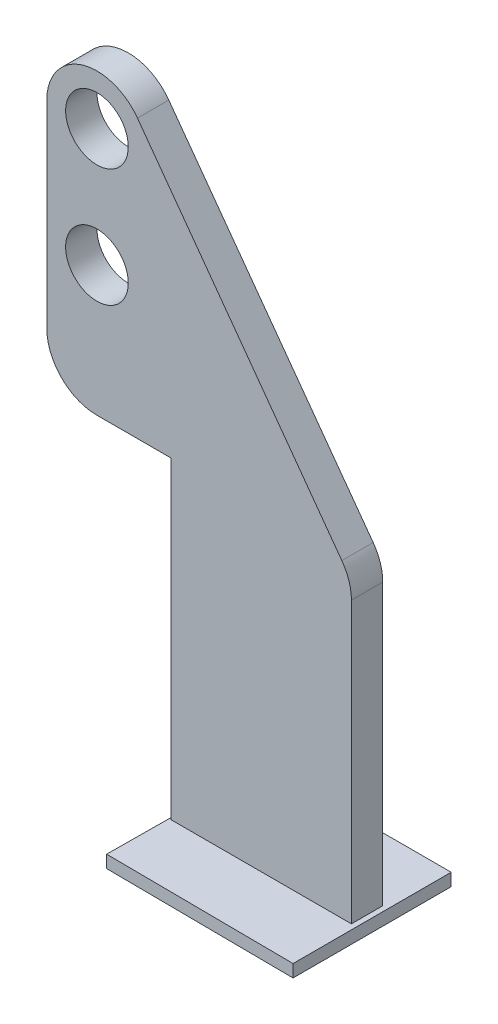
ISO-10303-21;
HEADER;
FILE_DESCRIPTION(('STEP AP214'),'2;1');
FILE_NAME('part.step','',(''),(''),'','','');
FILE_SCHEMA(('AUTOMOTIVE_DESIGN { 1 0 10303 214 1 1 1 1 }'));
ENDSEC;
DATA;
#1=APPLICATION_CONTEXT('core data for automotive mechanical design processes');
#2=APPLICATION_PROTOCOL_DEFINITION('international standard','automotive_design',2000,#1);
#3=PRODUCT_CONTEXT('',#1,'mechanical');
#4=PRODUCT('Part','Part','',(#3));
#5=PRODUCT_RELATED_PRODUCT_CATEGORY('part','',(#4));
#6=PRODUCT_DEFINITION_FORMATION('','',#4);
#7=PRODUCT_DEFINITION_CONTEXT('part definition',#1,'design');
#8=PRODUCT_DEFINITION('design','',#6,#7);
#9=PRODUCT_DEFINITION_SHAPE('','',#8);
#10=(LENGTH_UNIT() NAMED_UNIT(*) SI_UNIT(.MILLI.,.METRE.));
#11=(NAMED_UNIT(*) PLANE_ANGLE_UNIT() SI_UNIT($,.RADIAN.));
#12=(NAMED_UNIT(*) SI_UNIT($,.STERADIAN.) SOLID_ANGLE_UNIT());
#13=UNCERTAINTY_MEASURE_WITH_UNIT(LENGTH_MEASURE(1.E-05),#10,'distance_accuracy_value','');
#14=(GEOMETRIC_REPRESENTATION_CONTEXT(3) GLOBAL_UNCERTAINTY_ASSIGNED_CONTEXT((#13)) GLOBAL_UNIT_ASSIGNED_CONTEXT((#10,
#11,#12)) REPRESENTATION_CONTEXT('',''));
#15=CARTESIAN_POINT('',(0.,0.,0.));
#16=DIRECTION('',(0.,0.,1.));
#17=DIRECTION('',(1.,0.,0.));
#18=AXIS2_PLACEMENT_3D('',#15,#16,#17);
#19=CARTESIAN_POINT('',(5.28143268013956,-1.3339684011698,1.27));
#20=DIRECTION('',(0.,0.,1.));
#21=DIRECTION('',(1.,0.,0.));
#22=AXIS2_PLACEMENT_3D('',#19,#20,#21);
#23=PLANE('',#22);
#24=CARTESIAN_POINT('',(-3.00493153409958,10.0597565584507,1.27));
#25=DIRECTION('',(0.,0.,1.));
#26=DIRECTION('',(1.,0.,0.));
#27=AXIS2_PLACEMENT_3D('',#24,#25,#26);
#28=CIRCLE('',#27,1.27);
#29=CARTESIAN_POINT('',(-1.73493153409958,10.0597565584507,1.27));
#30=VERTEX_POINT('',#29);
#31=EDGE_CURVE('E151',#30,#30,#28,.T.);
#32=ORIENTED_EDGE('',*,*,#31,.F.);
#33=EDGE_LOOP('',(#32));
#34=FACE_BOUND('',#33,.T.);
#35=DIRECTION('',(0.,-1.,0.));
#36=VECTOR('',#35,1.);
#37=CARTESIAN_POINT('',(0.,0.,1.27));
#38=LINE('',#37,#36);
#39=CARTESIAN_POINT('',(0.,0.,1.27));
#40=VERTEX_POINT('',#39);
#41=CARTESIAN_POINT('',(0.,-12.7,1.27));
#42=VERTEX_POINT('',#41);
#43=EDGE_CURVE('E99',#40,#42,#38,.T.);
#44=ORIENTED_EDGE('',*,*,#43,.T.);
#45=DIRECTION('',(1.,0.,0.));
#46=VECTOR('',#45,1.);
#47=CARTESIAN_POINT('',(0.,-12.7,1.27));
#48=LINE('',#47,#46);
#49=CARTESIAN_POINT('',(7.31343268013956,-12.7,1.27));
#50=VERTEX_POINT('',#49);
#51=EDGE_CURVE('E208',#42,#50,#48,.T.);
#52=ORIENTED_EDGE('',*,*,#51,.T.);
#53=DIRECTION('',(0.,1.,0.));
#54=VECTOR('',#53,1.);
#55=CARTESIAN_POINT('',(7.31343268013956,-12.7,1.27));
#56=LINE('',#55,#54);
#57=CARTESIAN_POINT('',(7.31343268013956,-1.3339684011698,1.27));
#58=VERTEX_POINT('',#57);
#59=EDGE_CURVE('E197',#50,#58,#56,.T.);
#60=ORIENTED_EDGE('',*,*,#59,.T.);
#61=CARTESIAN_POINT('',(5.28143268013956,-1.3339684011698,1.27));
#62=DIRECTION('',(0.,0.,1.));
#63=DIRECTION('',(1.,0.,0.));
#64=AXIS2_PLACEMENT_3D('',#61,#62,#63);
#65=CIRCLE('',#64,2.032);
#66=CARTESIAN_POINT('',(6.92478311436092,-0.138801739007376,1.27));
#67=VERTEX_POINT('',#66);
#68=EDGE_CURVE('E223',#58,#67,#65,.T.);
#69=ORIENTED_EDGE('',*,*,#68,.T.);
#70=DIRECTION('',(-0.588172569961821,0.808735449912088,0.));
#71=VECTOR('',#70,1.);
#72=CARTESIAN_POINT('',(6.92478311436092,-0.138801739007376,1.27));
#73=LINE('',#72,#71);
#74=CARTESIAN_POINT('',(-1.36158109987822,11.2549232206131,1.27));
#75=VERTEX_POINT('',#74);
#76=EDGE_CURVE('E218',#67,#75,#73,.T.);
#77=ORIENTED_EDGE('',*,*,#76,.T.);
#78=CARTESIAN_POINT('',(-3.00493153409958,10.0597565584507,1.27));
#79=DIRECTION('',(0.,0.,1.));
#80=DIRECTION('',(1.,0.,0.));
#81=AXIS2_PLACEMENT_3D('',#78,#79,#80);
#82=CIRCLE('',#81,2.032);
#83=CARTESIAN_POINT('',(-5.03693153409958,10.0597565584507,1.27));
#84=VERTEX_POINT('',#83);
#85=EDGE_CURVE('E124',#75,#84,#82,.T.);
#86=ORIENTED_EDGE('',*,*,#85,.T.);
#87=DIRECTION('',(0.,-1.,0.));
#88=VECTOR('',#87,1.);
#89=CARTESIAN_POINT('',(-5.03693153409958,10.0597565584507,1.27));
#90=LINE('',#89,#88);
#91=CARTESIAN_POINT('',(-5.03693153409958,2.032,1.27));
#92=VERTEX_POINT('',#91);
#93=EDGE_CURVE('E118',#84,#92,#90,.T.);
#94=ORIENTED_EDGE('',*,*,#93,.T.);
#95=CARTESIAN_POINT('',(-3.00493153409958,2.032,1.27));
#96=DIRECTION('',(0.,0.,1.));
#97=DIRECTION('',(1.,0.,0.));
#98=AXIS2_PLACEMENT_3D('',#95,#96,#97);
#99=CIRCLE('',#98,2.032);
#100=CARTESIAN_POINT('',(-3.00493153409956,0.,1.27));
#101=VERTEX_POINT('',#100);
#102=EDGE_CURVE('E122',#92,#101,#99,.T.);
#103=ORIENTED_EDGE('',*,*,#102,.T.);
#104=DIRECTION('',(1.,0.,0.));
#105=VECTOR('',#104,1.);
#106=CARTESIAN_POINT('',(-3.00493153409956,0.,1.27));
#107=LINE('',#106,#105);
#108=EDGE_CURVE('E57',#101,#40,#107,.T.);
#109=ORIENTED_EDGE('',*,*,#108,.T.);
#110=EDGE_LOOP('',(#44,#52,#60,#69,#77,#86,#94,#103,#109));
#111=FACE_BOUND('',#110,.T.);
#112=CARTESIAN_POINT('',(-3.00493153409957,5.27395868039093,1.27));
#113=DIRECTION('',(0.,0.,1.));
#114=DIRECTION('',(1.,0.,0.));
#115=AXIS2_PLACEMENT_3D('',#112,#113,#114);
#116=CIRCLE('',#115,1.27);
#117=CARTESIAN_POINT('',(-1.73493153409957,5.27395868039093,1.27));
#118=VERTEX_POINT('',#117);
#119=EDGE_CURVE('E240',#118,#118,#116,.T.);
#120=ORIENTED_EDGE('',*,*,#119,.F.);
#121=EDGE_LOOP('',(#120));
#122=FACE_BOUND('',#121,.T.);
#123=ADVANCED_FACE('F39',(#34,#111,#122),#23,.T.);
#124=CARTESIAN_POINT('',(5.28143268013956,-1.3339684011698,0.));
#125=DIRECTION('',(0.,0.,1.));
#126=DIRECTION('',(1.,0.,0.));
#127=AXIS2_PLACEMENT_3D('',#124,#125,#126);
#128=PLANE('',#127);
#129=DIRECTION('',(0.,-1.,0.));
#130=VECTOR('',#129,1.);
#131=CARTESIAN_POINT('',(0.,0.,0.));
#132=LINE('',#131,#130);
#133=CARTESIAN_POINT('',(0.,0.,0.));
#134=VERTEX_POINT('',#133);
#135=CARTESIAN_POINT('',(0.,-12.7,0.));
#136=VERTEX_POINT('',#135);
#137=EDGE_CURVE('E146',#134,#136,#132,.T.);
#138=ORIENTED_EDGE('',*,*,#137,.F.);
#139=DIRECTION('',(1.,0.,0.));
#140=VECTOR('',#139,1.);
#141=CARTESIAN_POINT('',(-3.00493153409956,0.,0.));
#142=LINE('',#141,#140);
#143=CARTESIAN_POINT('',(-3.00493153409956,0.,0.));
#144=VERTEX_POINT('',#143);
#145=EDGE_CURVE('E93',#144,#134,#142,.T.);
#146=ORIENTED_EDGE('',*,*,#145,.F.);
#147=CARTESIAN_POINT('',(-3.00493153409958,2.032,0.));
#148=DIRECTION('',(0.,0.,1.));
#149=DIRECTION('',(1.,0.,0.));
#150=AXIS2_PLACEMENT_3D('',#147,#148,#149);
#151=CIRCLE('',#150,2.032);
#152=CARTESIAN_POINT('',(-5.03693153409958,2.032,0.));
#153=VERTEX_POINT('',#152);
#154=EDGE_CURVE('E87',#153,#144,#151,.T.);
#155=ORIENTED_EDGE('',*,*,#154,.F.);
#156=DIRECTION('',(0.,-1.,0.));
#157=VECTOR('',#156,1.);
#158=CARTESIAN_POINT('',(-5.03693153409958,10.0597565584507,0.));
#159=LINE('',#158,#157);
#160=CARTESIAN_POINT('',(-5.03693153409958,10.0597565584507,0.));
#161=VERTEX_POINT('',#160);
#162=EDGE_CURVE('E133',#161,#153,#159,.T.);
#163=ORIENTED_EDGE('',*,*,#162,.F.);
#164=CARTESIAN_POINT('',(-3.00493153409958,10.0597565584507,0.));
#165=DIRECTION('',(0.,0.,1.));
#166=DIRECTION('',(1.,0.,0.));
#167=AXIS2_PLACEMENT_3D('',#164,#165,#166);
#168=CIRCLE('',#167,2.032);
#169=CARTESIAN_POINT('',(-1.36158109987822,11.2549232206131,0.));
#170=VERTEX_POINT('',#169);
#171=EDGE_CURVE('E164',#170,#161,#168,.T.);
#172=ORIENTED_EDGE('',*,*,#171,.F.);
#173=DIRECTION('',(-0.588172569961821,0.808735449912088,0.));
#174=VECTOR('',#173,1.);
#175=CARTESIAN_POINT('',(6.92478311436092,-0.138801739007376,0.));
#176=LINE('',#175,#174);
#177=CARTESIAN_POINT('',(6.92478311436092,-0.138801739007376,0.));
#178=VERTEX_POINT('',#177);
#179=EDGE_CURVE('E161',#178,#170,#176,.T.);
#180=ORIENTED_EDGE('',*,*,#179,.F.);
#181=CARTESIAN_POINT('',(5.28143268013956,-1.3339684011698,0.));
#182=DIRECTION('',(0.,0.,1.));
#183=DIRECTION('',(1.,0.,0.));
#184=AXIS2_PLACEMENT_3D('',#181,#182,#183);
#185=CIRCLE('',#184,2.032);
#186=CARTESIAN_POINT('',(7.31343268013956,-1.3339684011698,0.));
#187=VERTEX_POINT('',#186);
#188=EDGE_CURVE('E158',#187,#178,#185,.T.);
#189=ORIENTED_EDGE('',*,*,#188,.F.);
#190=DIRECTION('',(0.,1.,0.));
#191=VECTOR('',#190,1.);
#192=CARTESIAN_POINT('',(7.31343268013956,-12.7,0.));
#193=LINE('',#192,#191);
#194=CARTESIAN_POINT('',(7.31343268013956,-12.7,0.));
#195=VERTEX_POINT('',#194);
#196=EDGE_CURVE('E155',#195,#187,#193,.T.);
#197=ORIENTED_EDGE('',*,*,#196,.F.);
#198=DIRECTION('',(1.,0.,0.));
#199=VECTOR('',#198,1.);
#200=CARTESIAN_POINT('',(0.,-12.7,0.));
#201=LINE('',#200,#199);
#202=EDGE_CURVE('E150',#136,#195,#201,.T.);
#203=ORIENTED_EDGE('',*,*,#202,.F.);
#204=EDGE_LOOP('',(#138,#146,#155,#163,#172,#180,#189,#197,#203));
#205=FACE_BOUND('',#204,.T.);
#206=CARTESIAN_POINT('',(-3.00493153409958,10.0597565584507,0.));
#207=DIRECTION('',(0.,0.,1.));
#208=DIRECTION('',(1.,0.,0.));
#209=AXIS2_PLACEMENT_3D('',#206,#207,#208);
#210=CIRCLE('',#209,1.27);
#211=CARTESIAN_POINT('',(-1.73493153409958,10.0597565584507,0.));
#212=VERTEX_POINT('',#211);
#213=EDGE_CURVE('E236',#212,#212,#210,.T.);
#214=ORIENTED_EDGE('',*,*,#213,.T.);
#215=EDGE_LOOP('',(#214));
#216=FACE_BOUND('',#215,.T.);
#217=CARTESIAN_POINT('',(-3.00493153409957,5.27395868039093,0.));
#218=DIRECTION('',(0.,0.,1.));
#219=DIRECTION('',(1.,0.,0.));
#220=AXIS2_PLACEMENT_3D('',#217,#218,#219);
#221=CIRCLE('',#220,1.27);
#222=CARTESIAN_POINT('',(-1.73493153409957,5.27395868039093,0.));
#223=VERTEX_POINT('',#222);
#224=EDGE_CURVE('E244',#223,#223,#221,.T.);
#225=ORIENTED_EDGE('',*,*,#224,.T.);
#226=EDGE_LOOP('',(#225));
#227=FACE_BOUND('',#226,.T.);
#228=ADVANCED_FACE('F204',(#205,#216,#227),#128,.F.);
#229=CARTESIAN_POINT('',(0.,0.,1.27));
#230=DIRECTION('',(1.,0.,0.));
#231=DIRECTION('',(0.,1.,0.));
#232=AXIS2_PLACEMENT_3D('',#229,#230,#231);
#233=PLANE('',#232);
#234=ORIENTED_EDGE('',*,*,#137,.T.);
#235=DIRECTION('',(0.,0.,-1.));
#236=VECTOR('',#235,1.);
#237=CARTESIAN_POINT('',(0.,-12.7,1.27));
#238=LINE('',#237,#236);
#239=EDGE_CURVE('E11',#42,#136,#238,.T.);
#240=ORIENTED_EDGE('',*,*,#239,.F.);
#241=ORIENTED_EDGE('',*,*,#43,.F.);
#242=DIRECTION('',(0.,0.,-1.));
#243=VECTOR('',#242,1.);
#244=CARTESIAN_POINT('',(0.,0.,1.27));
#245=LINE('',#244,#243);
#246=EDGE_CURVE('E142',#40,#134,#245,.T.);
#247=ORIENTED_EDGE('',*,*,#246,.T.);
#248=EDGE_LOOP('',(#234,#240,#241,#247));
#249=FACE_BOUND('',#248,.T.);
#250=ADVANCED_FACE('F41',(#249),#233,.F.);
#251=CARTESIAN_POINT('',(7.31343268013956,-12.7,1.27));
#252=DIRECTION('',(-1.,0.,0.));
#253=DIRECTION('',(0.,0.,1.));
#254=AXIS2_PLACEMENT_3D('',#251,#252,#253);
#255=PLANE('',#254);
#256=ORIENTED_EDGE('',*,*,#196,.T.);
#257=DIRECTION('',(0.,0.,-1.));
#258=VECTOR('',#257,1.);
#259=CARTESIAN_POINT('',(7.31343268013956,-1.3339684011698,1.27));
#260=LINE('',#259,#258);
#261=EDGE_CURVE('E187',#58,#187,#260,.T.);
#262=ORIENTED_EDGE('',*,*,#261,.F.);
#263=ORIENTED_EDGE('',*,*,#59,.F.);
#264=DIRECTION('',(0.,0.,-1.));
#265=VECTOR('',#264,1.);
#266=CARTESIAN_POINT('',(7.31343268013956,-12.7,1.27));
#267=LINE('',#266,#265);
#268=EDGE_CURVE('E49',#50,#195,#267,.T.);
#269=ORIENTED_EDGE('',*,*,#268,.T.);
#270=EDGE_LOOP('',(#256,#262,#263,#269));
#271=FACE_BOUND('',#270,.T.);
#272=ADVANCED_FACE('F195',(#271),#255,.F.);
#273=CARTESIAN_POINT('',(5.28143268013956,-1.3339684011698,1.27));
#274=DIRECTION('',(0.,0.,-1.));
#275=DIRECTION('',(-1.,0.,0.));
#276=AXIS2_PLACEMENT_3D('',#273,#274,#275);
#277=CYLINDRICAL_SURFACE('',#276,2.032);
#278=ORIENTED_EDGE('',*,*,#188,.T.);
#279=DIRECTION('',(0.,0.,-1.));
#280=VECTOR('',#279,1.);
#281=CARTESIAN_POINT('',(6.92478311436092,-0.138801739007376,1.27));
#282=LINE('',#281,#280);
#283=EDGE_CURVE('E183',#67,#178,#282,.T.);
#284=ORIENTED_EDGE('',*,*,#283,.F.);
#285=ORIENTED_EDGE('',*,*,#68,.F.);
#286=ORIENTED_EDGE('',*,*,#261,.T.);
#287=EDGE_LOOP('',(#278,#284,#285,#286));
#288=FACE_BOUND('',#287,.T.);
#289=ADVANCED_FACE('F222',(#288),#277,.T.);
#290=CARTESIAN_POINT('',(6.92478311436092,-0.138801739007376,1.27));
#291=DIRECTION('',(-0.808735449912088,-0.588172569961821,0.));
#292=DIRECTION('',(0.588172569961821,-0.808735449912088,0.));
#293=AXIS2_PLACEMENT_3D('',#290,#291,#292);
#294=PLANE('',#293);
#295=ORIENTED_EDGE('',*,*,#179,.T.);
#296=DIRECTION('',(0.,0.,-1.));
#297=VECTOR('',#296,1.);
#298=CARTESIAN_POINT('',(-1.36158109987822,11.2549232206131,1.27));
#299=LINE('',#298,#297);
#300=EDGE_CURVE('E179',#75,#170,#299,.T.);
#301=ORIENTED_EDGE('',*,*,#300,.F.);
#302=ORIENTED_EDGE('',*,*,#76,.F.);
#303=ORIENTED_EDGE('',*,*,#283,.T.);
#304=EDGE_LOOP('',(#295,#301,#302,#303));
#305=FACE_BOUND('',#304,.T.);
#306=ADVANCED_FACE('F217',(#305),#294,.F.);
#307=CARTESIAN_POINT('',(-3.00493153409958,10.0597565584507,1.27));
#308=DIRECTION('',(0.,0.,-1.));
#309=DIRECTION('',(-1.,0.,0.));
#310=AXIS2_PLACEMENT_3D('',#307,#308,#309);
#311=CYLINDRICAL_SURFACE('',#310,2.032);
#312=ORIENTED_EDGE('',*,*,#171,.T.);
#313=DIRECTION('',(0.,0.,-1.));
#314=VECTOR('',#313,1.);
#315=CARTESIAN_POINT('',(-5.03693153409958,10.0597565584507,1.27));
#316=LINE('',#315,#314);
#317=EDGE_CURVE('E135',#84,#161,#316,.T.);
#318=ORIENTED_EDGE('',*,*,#317,.F.);
#319=ORIENTED_EDGE('',*,*,#85,.F.);
#320=ORIENTED_EDGE('',*,*,#300,.T.);
#321=EDGE_LOOP('',(#312,#318,#319,#320));
#322=FACE_BOUND('',#321,.T.);
#323=ADVANCED_FACE('F213',(#322),#311,.T.);
#324=CARTESIAN_POINT('',(-5.03693153409958,10.0597565584507,1.27));
#325=DIRECTION('',(1.,0.,0.));
#326=DIRECTION('',(0.,1.,0.));
#327=AXIS2_PLACEMENT_3D('',#324,#325,#326);
#328=PLANE('',#327);
#329=ORIENTED_EDGE('',*,*,#162,.T.);
#330=DIRECTION('',(0.,0.,-1.));
#331=VECTOR('',#330,1.);
#332=CARTESIAN_POINT('',(-5.03693153409958,2.032,1.27));
#333=LINE('',#332,#331);
#334=EDGE_CURVE('E130',#92,#153,#333,.T.);
#335=ORIENTED_EDGE('',*,*,#334,.F.);
#336=ORIENTED_EDGE('',*,*,#93,.F.);
#337=ORIENTED_EDGE('',*,*,#317,.T.);
#338=EDGE_LOOP('',(#329,#335,#336,#337));
#339=FACE_BOUND('',#338,.T.);
#340=ADVANCED_FACE('F131',(#339),#328,.F.);
#341=CARTESIAN_POINT('',(-3.00493153409958,2.032,1.27));
#342=DIRECTION('',(0.,0.,-1.));
#343=DIRECTION('',(-1.,0.,0.));
#344=AXIS2_PLACEMENT_3D('',#341,#342,#343);
#345=CYLINDRICAL_SURFACE('',#344,2.032);
#346=ORIENTED_EDGE('',*,*,#154,.T.);
#347=DIRECTION('',(0.,0.,-1.));
#348=VECTOR('',#347,1.);
#349=CARTESIAN_POINT('',(-3.00493153409956,0.,1.27));
#350=LINE('',#349,#348);
#351=EDGE_CURVE('E136',#101,#144,#350,.T.);
#352=ORIENTED_EDGE('',*,*,#351,.F.);
#353=ORIENTED_EDGE('',*,*,#102,.F.);
#354=ORIENTED_EDGE('',*,*,#334,.T.);
#355=EDGE_LOOP('',(#346,#352,#353,#354));
#356=FACE_BOUND('',#355,.T.);
#357=ADVANCED_FACE('F138',(#356),#345,.T.);
#358=CARTESIAN_POINT('',(-3.00493153409956,0.,1.27));
#359=DIRECTION('',(0.,1.,0.));
#360=DIRECTION('',(0.,0.,1.));
#361=AXIS2_PLACEMENT_3D('',#358,#359,#360);
#362=PLANE('',#361);
#363=ORIENTED_EDGE('',*,*,#145,.T.);
#364=ORIENTED_EDGE('',*,*,#246,.F.);
#365=ORIENTED_EDGE('',*,*,#108,.F.);
#366=ORIENTED_EDGE('',*,*,#351,.T.);
#367=EDGE_LOOP('',(#363,#364,#365,#366));
#368=FACE_BOUND('',#367,.T.);
#369=ADVANCED_FACE('F354',(#368),#362,.F.);
#370=CARTESIAN_POINT('',(-3.00493153409958,10.0597565584507,1.27));
#371=DIRECTION('',(0.,0.,-1.));
#372=DIRECTION('',(-1.,0.,0.));
#373=AXIS2_PLACEMENT_3D('',#370,#371,#372);
#374=CYLINDRICAL_SURFACE('',#373,1.27);
#375=ORIENTED_EDGE('',*,*,#31,.T.);
#376=EDGE_LOOP('',(#375));
#377=FACE_BOUND('',#376,.T.);
#378=ORIENTED_EDGE('',*,*,#213,.F.);
#379=EDGE_LOOP('',(#378));
#380=FACE_BOUND('',#379,.T.);
#381=ADVANCED_FACE('F338',(#377,#380),#374,.F.);
#382=CARTESIAN_POINT('',(-3.00493153409957,5.27395868039093,1.27));
#383=DIRECTION('',(0.,0.,-1.));
#384=DIRECTION('',(-1.,0.,0.));
#385=AXIS2_PLACEMENT_3D('',#382,#383,#384);
#386=CYLINDRICAL_SURFACE('',#385,1.27);
#387=ORIENTED_EDGE('',*,*,#119,.T.);
#388=EDGE_LOOP('',(#387));
#389=FACE_BOUND('',#388,.T.);
#390=ORIENTED_EDGE('',*,*,#224,.F.);
#391=EDGE_LOOP('',(#390));
#392=FACE_BOUND('',#391,.T.);
#393=ADVANCED_FACE('F331',(#389,#392),#386,.F.);
#394=CARTESIAN_POINT('',(0.,-12.7,0.));
#395=DIRECTION('',(0.,-1.,0.));
#396=DIRECTION('',(0.,0.,-1.));
#397=AXIS2_PLACEMENT_3D('',#394,#395,#396);
#398=PLANE('',#397);
#399=DIRECTION('',(-0.999967678734548,0.,-0.00803999292541896));
#400=VECTOR('',#399,1.);
#401=CARTESIAN_POINT('',(7.52318228020664,-12.7,3.84633775789881));
#402=LINE('',#401,#400);
#403=CARTESIAN_POINT('',(7.52318228020664,-12.7,3.84633775789881));
#404=VERTEX_POINT('',#403);
#405=CARTESIAN_POINT('',(-0.0968177197933637,-12.7,3.78507103158899));
#406=VERTEX_POINT('',#405);
#407=EDGE_CURVE('E281',#404,#406,#402,.T.);
#408=ORIENTED_EDGE('',*,*,#407,.F.);
#409=DIRECTION('',(0.,0.,1.));
#410=VECTOR('',#409,1.);
#411=CARTESIAN_POINT('',(7.52318228020664,-12.7,-2.56492896841101));
#412=LINE('',#411,#410);
#413=CARTESIAN_POINT('',(7.52318228020664,-12.7,-2.56492896841101));
#414=VERTEX_POINT('',#413);
#415=EDGE_CURVE('E268',#414,#404,#412,.T.);
#416=ORIENTED_EDGE('',*,*,#415,.F.);
#417=DIRECTION('',(1.,0.,0.));
#418=VECTOR('',#417,1.);
#419=CARTESIAN_POINT('',(-0.0457621145351832,-12.7,-2.56492896841101));
#420=LINE('',#419,#418);
#421=CARTESIAN_POINT('',(-0.0457621145351832,-12.7,-2.56492896841101));
#422=VERTEX_POINT('',#421);
#423=EDGE_CURVE('E273',#422,#414,#420,.T.);
#424=ORIENTED_EDGE('',*,*,#423,.F.);
#425=DIRECTION('',(0.00803999292541892,0.,-0.999967678734548));
#426=VECTOR('',#425,1.);
#427=CARTESIAN_POINT('',(-0.0968177197933637,-12.7,3.78507103158899));
#428=LINE('',#427,#426);
#429=EDGE_CURVE('E277',#406,#422,#428,.T.);
#430=ORIENTED_EDGE('',*,*,#429,.F.);
#431=EDGE_LOOP('',(#408,#416,#424,#430));
#432=FACE_BOUND('',#431,.T.);
#433=ORIENTED_EDGE('',*,*,#239,.T.);
#434=ORIENTED_EDGE('',*,*,#202,.T.);
#435=ORIENTED_EDGE('',*,*,#268,.F.);
#436=ORIENTED_EDGE('',*,*,#51,.F.);
#437=EDGE_LOOP('',(#433,#434,#435,#436));
#438=FACE_BOUND('',#437,.T.);
#439=ADVANCED_FACE('F207',(#432,#438),#398,.F.);
#440=CARTESIAN_POINT('',(7.52318228020664,-13.208,3.84633775789881));
#441=DIRECTION('',(0.00803999292541895,0.,-0.999967678734548));
#442=DIRECTION('',(-0.999967678734548,0.,-0.00803999292541895));
#443=AXIS2_PLACEMENT_3D('',#440,#441,#442);
#444=PLANE('',#443);
#445=ORIENTED_EDGE('',*,*,#407,.T.);
#446=DIRECTION('',(0.,1.,0.));
#447=VECTOR('',#446,1.);
#448=CARTESIAN_POINT('',(-0.0968177197933637,-13.208,3.78507103158899));
#449=LINE('',#448,#447);
#450=CARTESIAN_POINT('',(-0.0968177197933637,-13.208,3.78507103158899));
#451=VERTEX_POINT('',#450);
#452=EDGE_CURVE('E248',#451,#406,#449,.T.);
#453=ORIENTED_EDGE('',*,*,#452,.F.);
#454=DIRECTION('',(-0.999967678734548,0.,-0.00803999292541896));
#455=VECTOR('',#454,1.);
#456=CARTESIAN_POINT('',(7.52318228020664,-13.208,3.84633775789881));
#457=LINE('',#456,#455);
#458=CARTESIAN_POINT('',(7.52318228020664,-13.208,3.84633775789881));
#459=VERTEX_POINT('',#458);
#460=EDGE_CURVE('E272',#459,#451,#457,.T.);
#461=ORIENTED_EDGE('',*,*,#460,.F.);
#462=DIRECTION('',(0.,1.,0.));
#463=VECTOR('',#462,1.);
#464=CARTESIAN_POINT('',(7.52318228020664,-13.208,3.84633775789881));
#465=LINE('',#464,#463);
#466=EDGE_CURVE('E263',#459,#404,#465,.T.);
#467=ORIENTED_EDGE('',*,*,#466,.T.);
#468=EDGE_LOOP('',(#445,#453,#461,#467));
#469=FACE_BOUND('',#468,.T.);
#470=ADVANCED_FACE('F311',(#469),#444,.F.);
#471=CARTESIAN_POINT('',(-0.0968177197933637,-13.208,3.78507103158899));
#472=DIRECTION('',(0.999967678734548,0.,0.00803999292541892));
#473=DIRECTION('',(0.00803999292541892,0.,-0.999967678734548));
#474=AXIS2_PLACEMENT_3D('',#471,#472,#473);
#475=PLANE('',#474);
#476=ORIENTED_EDGE('',*,*,#429,.T.);
#477=DIRECTION('',(0.,1.,0.));
#478=VECTOR('',#477,1.);
#479=CARTESIAN_POINT('',(-0.0457621145351832,-13.208,-2.56492896841101));
#480=LINE('',#479,#478);
#481=CARTESIAN_POINT('',(-0.0457621145351832,-13.208,-2.56492896841101));
#482=VERTEX_POINT('',#481);
#483=EDGE_CURVE('E255',#482,#422,#480,.T.);
#484=ORIENTED_EDGE('',*,*,#483,.F.);
#485=DIRECTION('',(0.00803999292541892,0.,-0.999967678734548));
#486=VECTOR('',#485,1.);
#487=CARTESIAN_POINT('',(-0.0968177197933637,-13.208,3.78507103158899));
#488=LINE('',#487,#486);
#489=EDGE_CURVE('E292',#451,#482,#488,.T.);
#490=ORIENTED_EDGE('',*,*,#489,.F.);
#491=ORIENTED_EDGE('',*,*,#452,.T.);
#492=EDGE_LOOP('',(#476,#484,#490,#491));
#493=FACE_BOUND('',#492,.T.);
#494=ADVANCED_FACE('F315',(#493),#475,.F.);
#495=CARTESIAN_POINT('',(-0.0457621145351832,-13.208,-2.56492896841101));
#496=DIRECTION('',(0.,0.,1.));
#497=DIRECTION('',(1.,0.,0.));
#498=AXIS2_PLACEMENT_3D('',#495,#496,#497);
#499=PLANE('',#498);
#500=ORIENTED_EDGE('',*,*,#423,.T.);
#501=DIRECTION('',(0.,1.,0.));
#502=VECTOR('',#501,1.);
#503=CARTESIAN_POINT('',(7.52318228020664,-13.208,-2.56492896841101));
#504=LINE('',#503,#502);
#505=CARTESIAN_POINT('',(7.52318228020664,-13.208,-2.56492896841101));
#506=VERTEX_POINT('',#505);
#507=EDGE_CURVE('E259',#506,#414,#504,.T.);
#508=ORIENTED_EDGE('',*,*,#507,.F.);
#509=DIRECTION('',(1.,0.,0.));
#510=VECTOR('',#509,1.);
#511=CARTESIAN_POINT('',(-0.0457621145351832,-13.208,-2.56492896841101));
#512=LINE('',#511,#510);
#513=EDGE_CURVE('E288',#482,#506,#512,.T.);
#514=ORIENTED_EDGE('',*,*,#513,.F.);
#515=ORIENTED_EDGE('',*,*,#483,.T.);
#516=EDGE_LOOP('',(#500,#508,#514,#515));
#517=FACE_BOUND('',#516,.T.);
#518=ADVANCED_FACE('F446',(#517),#499,.F.);
#519=CARTESIAN_POINT('',(7.52318228020664,-13.208,-2.56492896841101));
#520=DIRECTION('',(-1.,0.,0.));
#521=DIRECTION('',(0.,0.,1.));
#522=AXIS2_PLACEMENT_3D('',#519,#520,#521);
#523=PLANE('',#522);
#524=ORIENTED_EDGE('',*,*,#415,.T.);
#525=ORIENTED_EDGE('',*,*,#466,.F.);
#526=DIRECTION('',(0.,0.,1.));
#527=VECTOR('',#526,1.);
#528=CARTESIAN_POINT('',(7.52318228020664,-13.208,-2.56492896841101));
#529=LINE('',#528,#527);
#530=EDGE_CURVE('E267',#506,#459,#529,.T.);
#531=ORIENTED_EDGE('',*,*,#530,.F.);
#532=ORIENTED_EDGE('',*,*,#507,.T.);
#533=EDGE_LOOP('',(#524,#525,#531,#532));
#534=FACE_BOUND('',#533,.T.);
#535=ADVANCED_FACE('F328',(#534),#523,.F.);
#536=CARTESIAN_POINT('',(0.,-13.208,0.));
#537=DIRECTION('',(0.,-1.,0.));
#538=DIRECTION('',(0.,0.,-1.));
#539=AXIS2_PLACEMENT_3D('',#536,#537,#538);
#540=PLANE('',#539);
#541=ORIENTED_EDGE('',*,*,#460,.T.);
#542=ORIENTED_EDGE('',*,*,#489,.T.);
#543=ORIENTED_EDGE('',*,*,#513,.T.);
#544=ORIENTED_EDGE('',*,*,#530,.T.);
#545=EDGE_LOOP('',(#541,#542,#543,#544));
#546=FACE_BOUND('',#545,.T.);
#547=ADVANCED_FACE('F302',(#546),#540,.T.);
#548=CLOSED_SHELL('',(#123,#228,#250,#272,#289,#306,#323,#340,#357,#369,#381,#393,#439,#470,
#494,#518,#535,#547));
#549=MANIFOLD_SOLID_BREP('B2',#548);
#550=ADVANCED_BREP_SHAPE_REPRESENTATION('',(#18,#549),#14);
#551=SHAPE_DEFINITION_REPRESENTATION(#9,#550);
ENDSEC;
END-ISO-10303-21;
